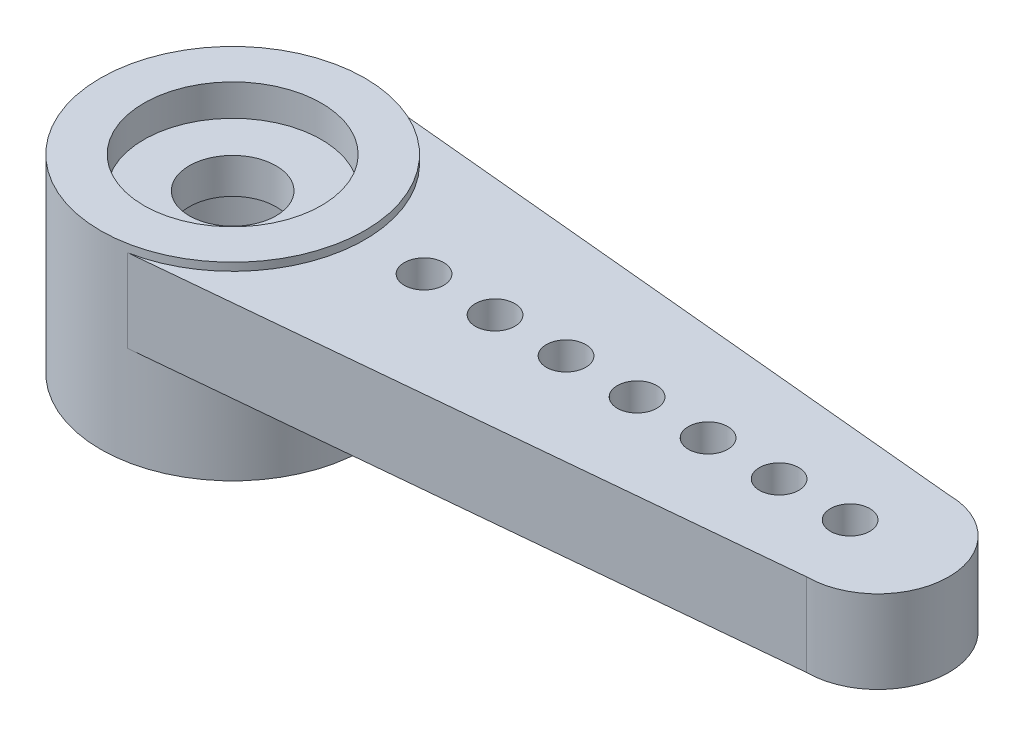
ISO-10303-21;
HEADER;
FILE_DESCRIPTION(('STEP AP214'),'2;1');
FILE_NAME('part.step','',(''),(''),'','','');
FILE_SCHEMA(('AUTOMOTIVE_DESIGN { 1 0 10303 214 1 1 1 1 }'));
ENDSEC;
DATA;
#1=APPLICATION_CONTEXT('core data for automotive mechanical design processes');
#2=APPLICATION_PROTOCOL_DEFINITION('international standard','automotive_design',2000,#1);
#3=PRODUCT_CONTEXT('',#1,'mechanical');
#4=PRODUCT('Part','Part','',(#3));
#5=PRODUCT_RELATED_PRODUCT_CATEGORY('part','',(#4));
#6=PRODUCT_DEFINITION_FORMATION('','',#4);
#7=PRODUCT_DEFINITION_CONTEXT('part definition',#1,'design');
#8=PRODUCT_DEFINITION('design','',#6,#7);
#9=PRODUCT_DEFINITION_SHAPE('','',#8);
#10=(LENGTH_UNIT() NAMED_UNIT(*) SI_UNIT(.MILLI.,.METRE.));
#11=(NAMED_UNIT(*) PLANE_ANGLE_UNIT() SI_UNIT($,.RADIAN.));
#12=(NAMED_UNIT(*) SI_UNIT($,.STERADIAN.) SOLID_ANGLE_UNIT());
#13=UNCERTAINTY_MEASURE_WITH_UNIT(LENGTH_MEASURE(1.E-05),#10,'distance_accuracy_value','');
#14=(GEOMETRIC_REPRESENTATION_CONTEXT(3) GLOBAL_UNCERTAINTY_ASSIGNED_CONTEXT((#13)) GLOBAL_UNIT_ASSIGNED_CONTEXT((#10,
#11,#12)) REPRESENTATION_CONTEXT('',''));
#15=CARTESIAN_POINT('',(0.,0.,0.));
#16=DIRECTION('',(0.,0.,1.));
#17=DIRECTION('',(1.,0.,0.));
#18=AXIS2_PLACEMENT_3D('',#15,#16,#17);
#19=CARTESIAN_POINT('',(-7.4,2.1,0.));
#20=DIRECTION('',(0.,-1.,0.));
#21=DIRECTION('',(0.,0.,-1.));
#22=AXIS2_PLACEMENT_3D('',#19,#20,#21);
#23=CYLINDRICAL_SURFACE('',#22,1.1);
#24=CARTESIAN_POINT('',(-7.4,1.5,0.));
#25=DIRECTION('',(0.,1.,0.));
#26=DIRECTION('',(0.,0.,1.));
#27=AXIS2_PLACEMENT_3D('',#24,#25,#26);
#28=CIRCLE('',#27,1.1);
#29=CARTESIAN_POINT('',(-7.4,1.5,1.1));
#30=VERTEX_POINT('',#29);
#31=EDGE_CURVE('E47',#30,#30,#28,.T.);
#32=ORIENTED_EDGE('',*,*,#31,.T.);
#33=EDGE_LOOP('',(#32));
#34=FACE_BOUND('',#33,.T.);
#35=CARTESIAN_POINT('',(-7.4,0.600000000000001,0.));
#36=DIRECTION('',(0.,-1.,0.));
#37=DIRECTION('',(0.,0.,-1.));
#38=AXIS2_PLACEMENT_3D('',#35,#36,#37);
#39=CIRCLE('',#38,1.1);
#40=CARTESIAN_POINT('',(-7.4,0.600000000000001,-1.1));
#41=VERTEX_POINT('',#40);
#42=EDGE_CURVE('E166',#41,#41,#39,.T.);
#43=ORIENTED_EDGE('',*,*,#42,.T.);
#44=EDGE_LOOP('',(#43));
#45=FACE_BOUND('',#44,.T.);
#46=ADVANCED_FACE('F44',(#34,#45),#23,.F.);
#47=CARTESIAN_POINT('',(-7.4,2.1,0.));
#48=DIRECTION('',(0.,-1.,0.));
#49=DIRECTION('',(0.,0.,-1.));
#50=AXIS2_PLACEMENT_3D('',#47,#48,#49);
#51=CYLINDRICAL_SURFACE('',#50,3.35);
#52=DIRECTION('',(0.,1.,0.));
#53=VECTOR('',#52,1.);
#54=CARTESIAN_POINT('',(-6.77048938733897,-2.5,3.29032162387617));
#55=LINE('',#54,#53);
#56=CARTESIAN_POINT('',(-6.77048938733898,2.1,3.29032162387617));
#57=VERTEX_POINT('',#56);
#58=CARTESIAN_POINT('',(-6.77048938733897,0.,3.29032162387617));
#59=VERTEX_POINT('',#58);
#60=EDGE_CURVE('E106',#57,#59,#55,.F.);
#61=ORIENTED_EDGE('',*,*,#60,.F.);
#62=CARTESIAN_POINT('',(-7.4,2.1,0.));
#63=DIRECTION('',(0.,1.,0.));
#64=DIRECTION('',(0.,0.,1.));
#65=AXIS2_PLACEMENT_3D('',#62,#63,#64);
#66=CIRCLE('',#65,3.35);
#67=CARTESIAN_POINT('',(-6.77048938733892,2.1,-3.29032162387617));
#68=VERTEX_POINT('',#67);
#69=EDGE_CURVE('E11',#57,#68,#66,.T.);
#70=ORIENTED_EDGE('',*,*,#69,.T.);
#71=DIRECTION('',(0.,1.,0.));
#72=VECTOR('',#71,1.);
#73=CARTESIAN_POINT('',(-6.77048938733892,-2.5,-3.29032162387617));
#74=LINE('',#73,#72);
#75=CARTESIAN_POINT('',(-6.77048938733892,0.,-3.29032162387617));
#76=VERTEX_POINT('',#75);
#77=EDGE_CURVE('E81',#68,#76,#74,.F.);
#78=ORIENTED_EDGE('',*,*,#77,.T.);
#79=CARTESIAN_POINT('',(-7.4,0.,0.));
#80=DIRECTION('',(0.,1.,0.));
#81=DIRECTION('',(0.,0.,1.));
#82=AXIS2_PLACEMENT_3D('',#79,#80,#81);
#83=CIRCLE('',#82,3.35);
#84=EDGE_CURVE('E93',#59,#76,#83,.T.);
#85=ORIENTED_EDGE('',*,*,#84,.F.);
#86=EDGE_LOOP('',(#61,#70,#78,#85));
#87=FACE_BOUND('',#86,.T.);
#88=CARTESIAN_POINT('',(-7.4,2.3,0.));
#89=DIRECTION('',(0.,1.,0.));
#90=DIRECTION('',(0.,0.,1.));
#91=AXIS2_PLACEMENT_3D('',#88,#89,#90);
#92=CIRCLE('',#91,3.35);
#93=CARTESIAN_POINT('',(-7.4,2.3,3.35));
#94=VERTEX_POINT('',#93);
#95=EDGE_CURVE('E120',#94,#94,#92,.T.);
#96=ORIENTED_EDGE('',*,*,#95,.F.);
#97=EDGE_LOOP('',(#96));
#98=FACE_BOUND('',#97,.T.);
#99=CARTESIAN_POINT('',(-7.4,-2.5,0.));
#100=DIRECTION('',(0.,1.,0.));
#101=DIRECTION('',(0.,0.,1.));
#102=AXIS2_PLACEMENT_3D('',#99,#100,#101);
#103=CIRCLE('',#102,3.35);
#104=CARTESIAN_POINT('',(-7.4,-2.5,3.35));
#105=VERTEX_POINT('',#104);
#106=EDGE_CURVE('E107',#105,#105,#103,.T.);
#107=ORIENTED_EDGE('',*,*,#106,.T.);
#108=EDGE_LOOP('',(#107));
#109=FACE_BOUND('',#108,.T.);
#110=ADVANCED_FACE('F104',(#87,#98,#109),#51,.T.);
#111=CARTESIAN_POINT('',(0.248841875984799,2.1,2.62488043377514));
#112=DIRECTION('',(-0.0943780711658674,0.,-0.995536428104472));
#113=DIRECTION('',(-0.995536428104472,0.,0.0943780711658674));
#114=AXIS2_PLACEMENT_3D('',#111,#112,#113);
#115=PLANE('',#114);
#116=DIRECTION('',(0.995536428104472,0.,-0.0943780711658674));
#117=VECTOR('',#116,1.);
#118=CARTESIAN_POINT('',(0.248841875984799,2.1,2.62488043377514));
#119=LINE('',#118,#117);
#120=CARTESIAN_POINT('',(8.95,2.1,1.8));
#121=VERTEX_POINT('',#120);
#122=EDGE_CURVE('E123',#57,#121,#119,.T.);
#123=ORIENTED_EDGE('',*,*,#122,.F.);
#124=ORIENTED_EDGE('',*,*,#60,.T.);
#125=DIRECTION('',(0.995536428104472,0.,-0.0943780711658674));
#126=VECTOR('',#125,1.);
#127=CARTESIAN_POINT('',(0.248841875984799,0.,2.62488043377514));
#128=LINE('',#127,#126);
#129=CARTESIAN_POINT('',(8.95,0.,1.8));
#130=VERTEX_POINT('',#129);
#131=EDGE_CURVE('E74',#59,#130,#128,.T.);
#132=ORIENTED_EDGE('',*,*,#131,.T.);
#133=DIRECTION('',(0.,-1.,0.));
#134=VECTOR('',#133,1.);
#135=CARTESIAN_POINT('',(8.95,2.1,1.8));
#136=LINE('',#135,#134);
#137=EDGE_CURVE('E53',#121,#130,#136,.T.);
#138=ORIENTED_EDGE('',*,*,#137,.F.);
#139=EDGE_LOOP('',(#123,#124,#132,#138));
#140=FACE_BOUND('',#139,.T.);
#141=ADVANCED_FACE('F160',(#140),#115,.F.);
#142=CARTESIAN_POINT('',(8.95,2.1,0.));
#143=DIRECTION('',(0.,-1.,0.));
#144=DIRECTION('',(0.,0.,-1.));
#145=AXIS2_PLACEMENT_3D('',#142,#143,#144);
#146=CYLINDRICAL_SURFACE('',#145,1.8);
#147=CARTESIAN_POINT('',(8.95,0.,0.));
#148=DIRECTION('',(0.,1.,0.));
#149=DIRECTION('',(0.,0.,1.));
#150=AXIS2_PLACEMENT_3D('',#147,#148,#149);
#151=CIRCLE('',#150,1.8);
#152=CARTESIAN_POINT('',(8.95,0.,-1.8));
#153=VERTEX_POINT('',#152);
#154=EDGE_CURVE('E127',#130,#153,#151,.T.);
#155=ORIENTED_EDGE('',*,*,#154,.T.);
#156=DIRECTION('',(0.,-1.,0.));
#157=VECTOR('',#156,1.);
#158=CARTESIAN_POINT('',(8.95,2.1,-1.8));
#159=LINE('',#158,#157);
#160=CARTESIAN_POINT('',(8.95,2.1,-1.8));
#161=VERTEX_POINT('',#160);
#162=EDGE_CURVE('E102',#161,#153,#159,.T.);
#163=ORIENTED_EDGE('',*,*,#162,.F.);
#164=CARTESIAN_POINT('',(8.95,2.1,0.));
#165=DIRECTION('',(0.,1.,0.));
#166=DIRECTION('',(0.,0.,1.));
#167=AXIS2_PLACEMENT_3D('',#164,#165,#166);
#168=CIRCLE('',#167,1.8);
#169=EDGE_CURVE('E100',#121,#161,#168,.T.);
#170=ORIENTED_EDGE('',*,*,#169,.F.);
#171=ORIENTED_EDGE('',*,*,#137,.T.);
#172=EDGE_LOOP('',(#155,#163,#170,#171));
#173=FACE_BOUND('',#172,.T.);
#174=ADVANCED_FACE('F133',(#173),#146,.T.);
#175=CARTESIAN_POINT('',(0.248841875984799,2.1,-2.62488043377514));
#176=DIRECTION('',(0.0943780711658672,0.,-0.995536428104472));
#177=DIRECTION('',(-0.995536428104472,0.,-0.0943780711658672));
#178=AXIS2_PLACEMENT_3D('',#175,#176,#177);
#179=PLANE('',#178);
#180=ORIENTED_EDGE('',*,*,#77,.F.);
#181=DIRECTION('',(0.995536428104472,0.,0.0943780711658672));
#182=VECTOR('',#181,1.);
#183=CARTESIAN_POINT('',(0.248841875984799,2.1,-2.62488043377514));
#184=LINE('',#183,#182);
#185=EDGE_CURVE('E62',#68,#161,#184,.T.);
#186=ORIENTED_EDGE('',*,*,#185,.T.);
#187=ORIENTED_EDGE('',*,*,#162,.T.);
#188=DIRECTION('',(0.995536428104472,0.,0.0943780711658672));
#189=VECTOR('',#188,1.);
#190=CARTESIAN_POINT('',(0.248841875984799,0.,-2.62488043377514));
#191=LINE('',#190,#189);
#192=EDGE_CURVE('E91',#76,#153,#191,.T.);
#193=ORIENTED_EDGE('',*,*,#192,.F.);
#194=EDGE_LOOP('',(#180,#186,#187,#193));
#195=FACE_BOUND('',#194,.T.);
#196=ADVANCED_FACE('F90',(#195),#179,.T.);
#197=CARTESIAN_POINT('',(0.,2.1,0.));
#198=DIRECTION('',(0.,1.,0.));
#199=DIRECTION('',(0.,0.,1.));
#200=AXIS2_PLACEMENT_3D('',#197,#198,#199);
#201=PLANE('',#200);
#202=CARTESIAN_POINT('',(-2.55,2.1,0.));
#203=DIRECTION('',(0.,1.,0.));
#204=DIRECTION('',(0.,0.,1.));
#205=AXIS2_PLACEMENT_3D('',#202,#203,#204);
#206=CIRCLE('',#205,0.5);
#207=CARTESIAN_POINT('',(-2.55,2.1,0.5));
#208=VERTEX_POINT('',#207);
#209=EDGE_CURVE('E174',#208,#208,#206,.T.);
#210=ORIENTED_EDGE('',*,*,#209,.F.);
#211=EDGE_LOOP('',(#210));
#212=FACE_BOUND('',#211,.T.);
#213=CARTESIAN_POINT('',(-0.75,2.1,0.));
#214=DIRECTION('',(0.,1.,0.));
#215=DIRECTION('',(0.,0.,1.));
#216=AXIS2_PLACEMENT_3D('',#213,#214,#215);
#217=CIRCLE('',#216,0.5);
#218=CARTESIAN_POINT('',(-0.75,2.1,0.5));
#219=VERTEX_POINT('',#218);
#220=EDGE_CURVE('E343',#219,#219,#217,.T.);
#221=ORIENTED_EDGE('',*,*,#220,.F.);
#222=EDGE_LOOP('',(#221));
#223=FACE_BOUND('',#222,.T.);
#224=CARTESIAN_POINT('',(1.05,2.1,0.));
#225=DIRECTION('',(0.,1.,0.));
#226=DIRECTION('',(0.,0.,1.));
#227=AXIS2_PLACEMENT_3D('',#224,#225,#226);
#228=CIRCLE('',#227,0.5);
#229=CARTESIAN_POINT('',(1.05,2.1,0.5));
#230=VERTEX_POINT('',#229);
#231=EDGE_CURVE('E350',#230,#230,#228,.T.);
#232=ORIENTED_EDGE('',*,*,#231,.F.);
#233=EDGE_LOOP('',(#232));
#234=FACE_BOUND('',#233,.T.);
#235=CARTESIAN_POINT('',(2.85,2.1,0.));
#236=DIRECTION('',(0.,1.,0.));
#237=DIRECTION('',(0.,0.,1.));
#238=AXIS2_PLACEMENT_3D('',#235,#236,#237);
#239=CIRCLE('',#238,0.5);
#240=CARTESIAN_POINT('',(2.85,2.1,0.5));
#241=VERTEX_POINT('',#240);
#242=EDGE_CURVE('E355',#241,#241,#239,.T.);
#243=ORIENTED_EDGE('',*,*,#242,.F.);
#244=EDGE_LOOP('',(#243));
#245=FACE_BOUND('',#244,.T.);
#246=CARTESIAN_POINT('',(4.65,2.1,0.));
#247=DIRECTION('',(0.,1.,0.));
#248=DIRECTION('',(0.,0.,1.));
#249=AXIS2_PLACEMENT_3D('',#246,#247,#248);
#250=CIRCLE('',#249,0.5);
#251=CARTESIAN_POINT('',(4.65,2.1,0.5));
#252=VERTEX_POINT('',#251);
#253=EDGE_CURVE('E361',#252,#252,#250,.T.);
#254=ORIENTED_EDGE('',*,*,#253,.F.);
#255=EDGE_LOOP('',(#254));
#256=FACE_BOUND('',#255,.T.);
#257=CARTESIAN_POINT('',(6.45,2.1,0.));
#258=DIRECTION('',(0.,1.,0.));
#259=DIRECTION('',(0.,0.,1.));
#260=AXIS2_PLACEMENT_3D('',#257,#258,#259);
#261=CIRCLE('',#260,0.499999999999999);
#262=CARTESIAN_POINT('',(6.45,2.1,0.499999999999999));
#263=VERTEX_POINT('',#262);
#264=EDGE_CURVE('E367',#263,#263,#261,.T.);
#265=ORIENTED_EDGE('',*,*,#264,.F.);
#266=EDGE_LOOP('',(#265));
#267=FACE_BOUND('',#266,.T.);
#268=CARTESIAN_POINT('',(8.25,2.1,0.));
#269=DIRECTION('',(0.,1.,0.));
#270=DIRECTION('',(0.,0.,1.));
#271=AXIS2_PLACEMENT_3D('',#268,#269,#270);
#272=CIRCLE('',#271,0.499999999999999);
#273=CARTESIAN_POINT('',(8.25,2.1,0.499999999999999));
#274=VERTEX_POINT('',#273);
#275=EDGE_CURVE('E177',#274,#274,#272,.T.);
#276=ORIENTED_EDGE('',*,*,#275,.F.);
#277=EDGE_LOOP('',(#276));
#278=FACE_BOUND('',#277,.T.);
#279=ORIENTED_EDGE('',*,*,#69,.F.);
#280=ORIENTED_EDGE('',*,*,#122,.T.);
#281=ORIENTED_EDGE('',*,*,#169,.T.);
#282=ORIENTED_EDGE('',*,*,#185,.F.);
#283=EDGE_LOOP('',(#279,#280,#281,#282));
#284=FACE_BOUND('',#283,.T.);
#285=ADVANCED_FACE('F97',(#212,#223,#234,#245,#256,#267,#278,#284),#201,.T.);
#286=CARTESIAN_POINT('',(0.,0.,0.));
#287=DIRECTION('',(0.,1.,0.));
#288=DIRECTION('',(0.,0.,1.));
#289=AXIS2_PLACEMENT_3D('',#286,#287,#288);
#290=PLANE('',#289);
#291=CARTESIAN_POINT('',(-2.55,0.,0.));
#292=DIRECTION('',(0.,1.,0.));
#293=DIRECTION('',(0.,0.,1.));
#294=AXIS2_PLACEMENT_3D('',#291,#292,#293);
#295=CIRCLE('',#294,0.5);
#296=CARTESIAN_POINT('',(-2.55,0.,0.5));
#297=VERTEX_POINT('',#296);
#298=EDGE_CURVE('E169',#297,#297,#295,.F.);
#299=ORIENTED_EDGE('',*,*,#298,.F.);
#300=EDGE_LOOP('',(#299));
#301=FACE_BOUND('',#300,.T.);
#302=CARTESIAN_POINT('',(-0.75,0.,0.));
#303=DIRECTION('',(0.,1.,0.));
#304=DIRECTION('',(0.,0.,1.));
#305=AXIS2_PLACEMENT_3D('',#302,#303,#304);
#306=CIRCLE('',#305,0.5);
#307=CARTESIAN_POINT('',(-0.75,0.,0.5));
#308=VERTEX_POINT('',#307);
#309=EDGE_CURVE('E346',#308,#308,#306,.F.);
#310=ORIENTED_EDGE('',*,*,#309,.F.);
#311=EDGE_LOOP('',(#310));
#312=FACE_BOUND('',#311,.T.);
#313=CARTESIAN_POINT('',(1.05,0.,0.));
#314=DIRECTION('',(0.,1.,0.));
#315=DIRECTION('',(0.,0.,1.));
#316=AXIS2_PLACEMENT_3D('',#313,#314,#315);
#317=CIRCLE('',#316,0.5);
#318=CARTESIAN_POINT('',(1.05,0.,0.5));
#319=VERTEX_POINT('',#318);
#320=EDGE_CURVE('E352',#319,#319,#317,.F.);
#321=ORIENTED_EDGE('',*,*,#320,.F.);
#322=EDGE_LOOP('',(#321));
#323=FACE_BOUND('',#322,.T.);
#324=CARTESIAN_POINT('',(2.85,0.,0.));
#325=DIRECTION('',(0.,1.,0.));
#326=DIRECTION('',(0.,0.,1.));
#327=AXIS2_PLACEMENT_3D('',#324,#325,#326);
#328=CIRCLE('',#327,0.5);
#329=CARTESIAN_POINT('',(2.85,0.,0.5));
#330=VERTEX_POINT('',#329);
#331=EDGE_CURVE('E358',#330,#330,#328,.F.);
#332=ORIENTED_EDGE('',*,*,#331,.F.);
#333=EDGE_LOOP('',(#332));
#334=FACE_BOUND('',#333,.T.);
#335=CARTESIAN_POINT('',(4.65,0.,0.));
#336=DIRECTION('',(0.,1.,0.));
#337=DIRECTION('',(0.,0.,1.));
#338=AXIS2_PLACEMENT_3D('',#335,#336,#337);
#339=CIRCLE('',#338,0.5);
#340=CARTESIAN_POINT('',(4.65,0.,0.5));
#341=VERTEX_POINT('',#340);
#342=EDGE_CURVE('E364',#341,#341,#339,.F.);
#343=ORIENTED_EDGE('',*,*,#342,.F.);
#344=EDGE_LOOP('',(#343));
#345=FACE_BOUND('',#344,.T.);
#346=CARTESIAN_POINT('',(6.45,0.,0.));
#347=DIRECTION('',(0.,1.,0.));
#348=DIRECTION('',(0.,0.,1.));
#349=AXIS2_PLACEMENT_3D('',#346,#347,#348);
#350=CIRCLE('',#349,0.499999999999999);
#351=CARTESIAN_POINT('',(6.45,0.,0.499999999999999));
#352=VERTEX_POINT('',#351);
#353=EDGE_CURVE('E370',#352,#352,#350,.F.);
#354=ORIENTED_EDGE('',*,*,#353,.F.);
#355=EDGE_LOOP('',(#354));
#356=FACE_BOUND('',#355,.T.);
#357=CARTESIAN_POINT('',(8.25,0.,0.));
#358=DIRECTION('',(0.,1.,0.));
#359=DIRECTION('',(0.,0.,1.));
#360=AXIS2_PLACEMENT_3D('',#357,#358,#359);
#361=CIRCLE('',#360,0.499999999999999);
#362=CARTESIAN_POINT('',(8.25,0.,0.499999999999999));
#363=VERTEX_POINT('',#362);
#364=EDGE_CURVE('E374',#363,#363,#361,.F.);
#365=ORIENTED_EDGE('',*,*,#364,.F.);
#366=EDGE_LOOP('',(#365));
#367=FACE_BOUND('',#366,.T.);
#368=ORIENTED_EDGE('',*,*,#131,.F.);
#369=ORIENTED_EDGE('',*,*,#84,.T.);
#370=ORIENTED_EDGE('',*,*,#192,.T.);
#371=ORIENTED_EDGE('',*,*,#154,.F.);
#372=EDGE_LOOP('',(#368,#369,#370,#371));
#373=FACE_BOUND('',#372,.T.);
#374=ADVANCED_FACE('F135',(#301,#312,#323,#334,#345,#356,#367,#373),#290,.F.);
#375=CARTESIAN_POINT('',(-7.4,2.3,0.));
#376=DIRECTION('',(0.,-1.,0.));
#377=DIRECTION('',(0.,0.,-1.));
#378=AXIS2_PLACEMENT_3D('',#375,#376,#377);
#379=CYLINDRICAL_SURFACE('',#378,2.25);
#380=CARTESIAN_POINT('',(-7.4,2.3,0.));
#381=DIRECTION('',(0.,1.,0.));
#382=DIRECTION('',(0.,0.,1.));
#383=AXIS2_PLACEMENT_3D('',#380,#381,#382);
#384=CIRCLE('',#383,2.25);
#385=CARTESIAN_POINT('',(-7.4,2.3,2.25));
#386=VERTEX_POINT('',#385);
#387=EDGE_CURVE('E117',#386,#386,#384,.T.);
#388=ORIENTED_EDGE('',*,*,#387,.T.);
#389=EDGE_LOOP('',(#388));
#390=FACE_BOUND('',#389,.T.);
#391=CARTESIAN_POINT('',(-7.4,1.5,0.));
#392=DIRECTION('',(0.,1.,0.));
#393=DIRECTION('',(0.,0.,1.));
#394=AXIS2_PLACEMENT_3D('',#391,#392,#393);
#395=CIRCLE('',#394,2.25);
#396=CARTESIAN_POINT('',(-7.4,1.5,2.25));
#397=VERTEX_POINT('',#396);
#398=EDGE_CURVE('E92',#397,#397,#395,.T.);
#399=ORIENTED_EDGE('',*,*,#398,.F.);
#400=EDGE_LOOP('',(#399));
#401=FACE_BOUND('',#400,.T.);
#402=ADVANCED_FACE('F137',(#390,#401),#379,.F.);
#403=CARTESIAN_POINT('',(0.,2.3,0.));
#404=DIRECTION('',(0.,1.,0.));
#405=DIRECTION('',(0.,0.,1.));
#406=AXIS2_PLACEMENT_3D('',#403,#404,#405);
#407=PLANE('',#406);
#408=ORIENTED_EDGE('',*,*,#387,.F.);
#409=EDGE_LOOP('',(#408));
#410=FACE_BOUND('',#409,.T.);
#411=ORIENTED_EDGE('',*,*,#95,.T.);
#412=EDGE_LOOP('',(#411));
#413=FACE_BOUND('',#412,.T.);
#414=ADVANCED_FACE('F145',(#410,#413),#407,.T.);
#415=CARTESIAN_POINT('',(-7.4,1.5,0.));
#416=DIRECTION('',(0.,1.,0.));
#417=DIRECTION('',(0.,0.,1.));
#418=AXIS2_PLACEMENT_3D('',#415,#416,#417);
#419=PLANE('',#418);
#420=ORIENTED_EDGE('',*,*,#31,.F.);
#421=EDGE_LOOP('',(#420));
#422=FACE_BOUND('',#421,.T.);
#423=ORIENTED_EDGE('',*,*,#398,.T.);
#424=EDGE_LOOP('',(#423));
#425=FACE_BOUND('',#424,.T.);
#426=ADVANCED_FACE('F187',(#422,#425),#419,.T.);
#427=CARTESIAN_POINT('',(-7.4,-2.5,0.));
#428=DIRECTION('',(0.,1.,0.));
#429=DIRECTION('',(0.,0.,1.));
#430=AXIS2_PLACEMENT_3D('',#427,#428,#429);
#431=CYLINDRICAL_SURFACE('',#430,2.25);
#432=CARTESIAN_POINT('',(-7.4,-2.5,0.));
#433=DIRECTION('',(0.,1.,0.));
#434=DIRECTION('',(0.,0.,1.));
#435=AXIS2_PLACEMENT_3D('',#432,#433,#434);
#436=CIRCLE('',#435,2.25);
#437=CARTESIAN_POINT('',(-7.4,-2.5,2.25));
#438=VERTEX_POINT('',#437);
#439=EDGE_CURVE('E111',#438,#438,#436,.T.);
#440=ORIENTED_EDGE('',*,*,#439,.F.);
#441=EDGE_LOOP('',(#440));
#442=FACE_BOUND('',#441,.T.);
#443=CARTESIAN_POINT('',(-7.4,0.600000000000001,0.));
#444=DIRECTION('',(0.,-1.,0.));
#445=DIRECTION('',(0.,0.,-1.));
#446=AXIS2_PLACEMENT_3D('',#443,#444,#445);
#447=CIRCLE('',#446,2.25);
#448=CARTESIAN_POINT('',(-7.4,0.600000000000001,-2.25));
#449=VERTEX_POINT('',#448);
#450=EDGE_CURVE('E168',#449,#449,#447,.T.);
#451=ORIENTED_EDGE('',*,*,#450,.F.);
#452=EDGE_LOOP('',(#451));
#453=FACE_BOUND('',#452,.T.);
#454=ADVANCED_FACE('F185',(#442,#453),#431,.F.);
#455=CARTESIAN_POINT('',(-7.4,-2.5,0.));
#456=DIRECTION('',(0.,1.,0.));
#457=DIRECTION('',(0.,0.,1.));
#458=AXIS2_PLACEMENT_3D('',#455,#456,#457);
#459=PLANE('',#458);
#460=ORIENTED_EDGE('',*,*,#439,.T.);
#461=EDGE_LOOP('',(#460));
#462=FACE_BOUND('',#461,.T.);
#463=ORIENTED_EDGE('',*,*,#106,.F.);
#464=EDGE_LOOP('',(#463));
#465=FACE_BOUND('',#464,.T.);
#466=ADVANCED_FACE('F182',(#462,#465),#459,.F.);
#467=CARTESIAN_POINT('',(-7.4,0.600000000000001,0.));
#468=DIRECTION('',(0.,-1.,0.));
#469=DIRECTION('',(0.,0.,-1.));
#470=AXIS2_PLACEMENT_3D('',#467,#468,#469);
#471=PLANE('',#470);
#472=ORIENTED_EDGE('',*,*,#42,.F.);
#473=EDGE_LOOP('',(#472));
#474=FACE_BOUND('',#473,.T.);
#475=ORIENTED_EDGE('',*,*,#450,.T.);
#476=EDGE_LOOP('',(#475));
#477=FACE_BOUND('',#476,.T.);
#478=ADVANCED_FACE('F191',(#474,#477),#471,.T.);
#479=CARTESIAN_POINT('',(8.25,-2.501,0.));
#480=DIRECTION('',(0.,1.,0.));
#481=DIRECTION('',(0.,0.,1.));
#482=AXIS2_PLACEMENT_3D('',#479,#480,#481);
#483=CYLINDRICAL_SURFACE('',#482,0.499999999999999);
#484=ORIENTED_EDGE('',*,*,#275,.T.);
#485=EDGE_LOOP('',(#484));
#486=FACE_BOUND('',#485,.T.);
#487=ORIENTED_EDGE('',*,*,#364,.T.);
#488=EDGE_LOOP('',(#487));
#489=FACE_BOUND('',#488,.T.);
#490=ADVANCED_FACE('F193',(#486,#489),#483,.F.);
#491=CARTESIAN_POINT('',(6.45,-2.501,0.));
#492=DIRECTION('',(0.,1.,0.));
#493=DIRECTION('',(0.,0.,1.));
#494=AXIS2_PLACEMENT_3D('',#491,#492,#493);
#495=CYLINDRICAL_SURFACE('',#494,0.499999999999999);
#496=ORIENTED_EDGE('',*,*,#264,.T.);
#497=EDGE_LOOP('',(#496));
#498=FACE_BOUND('',#497,.T.);
#499=ORIENTED_EDGE('',*,*,#353,.T.);
#500=EDGE_LOOP('',(#499));
#501=FACE_BOUND('',#500,.T.);
#502=ADVANCED_FACE('F197',(#498,#501),#495,.F.);
#503=CARTESIAN_POINT('',(4.65,-2.501,0.));
#504=DIRECTION('',(0.,1.,0.));
#505=DIRECTION('',(0.,0.,1.));
#506=AXIS2_PLACEMENT_3D('',#503,#504,#505);
#507=CYLINDRICAL_SURFACE('',#506,0.5);
#508=ORIENTED_EDGE('',*,*,#253,.T.);
#509=EDGE_LOOP('',(#508));
#510=FACE_BOUND('',#509,.T.);
#511=ORIENTED_EDGE('',*,*,#342,.T.);
#512=EDGE_LOOP('',(#511));
#513=FACE_BOUND('',#512,.T.);
#514=ADVANCED_FACE('F288',(#510,#513),#507,.F.);
#515=CARTESIAN_POINT('',(2.85,-2.501,0.));
#516=DIRECTION('',(0.,1.,0.));
#517=DIRECTION('',(0.,0.,1.));
#518=AXIS2_PLACEMENT_3D('',#515,#516,#517);
#519=CYLINDRICAL_SURFACE('',#518,0.5);
#520=ORIENTED_EDGE('',*,*,#242,.T.);
#521=EDGE_LOOP('',(#520));
#522=FACE_BOUND('',#521,.T.);
#523=ORIENTED_EDGE('',*,*,#331,.T.);
#524=EDGE_LOOP('',(#523));
#525=FACE_BOUND('',#524,.T.);
#526=ADVANCED_FACE('F297',(#522,#525),#519,.F.);
#527=CARTESIAN_POINT('',(1.05,-2.501,0.));
#528=DIRECTION('',(0.,1.,0.));
#529=DIRECTION('',(0.,0.,1.));
#530=AXIS2_PLACEMENT_3D('',#527,#528,#529);
#531=CYLINDRICAL_SURFACE('',#530,0.5);
#532=ORIENTED_EDGE('',*,*,#231,.T.);
#533=EDGE_LOOP('',(#532));
#534=FACE_BOUND('',#533,.T.);
#535=ORIENTED_EDGE('',*,*,#320,.T.);
#536=EDGE_LOOP('',(#535));
#537=FACE_BOUND('',#536,.T.);
#538=ADVANCED_FACE('F307',(#534,#537),#531,.F.);
#539=CARTESIAN_POINT('',(-0.75,-2.501,0.));
#540=DIRECTION('',(0.,1.,0.));
#541=DIRECTION('',(0.,0.,1.));
#542=AXIS2_PLACEMENT_3D('',#539,#540,#541);
#543=CYLINDRICAL_SURFACE('',#542,0.5);
#544=ORIENTED_EDGE('',*,*,#220,.T.);
#545=EDGE_LOOP('',(#544));
#546=FACE_BOUND('',#545,.T.);
#547=ORIENTED_EDGE('',*,*,#309,.T.);
#548=EDGE_LOOP('',(#547));
#549=FACE_BOUND('',#548,.T.);
#550=ADVANCED_FACE('F317',(#546,#549),#543,.F.);
#551=CARTESIAN_POINT('',(-2.55,-2.501,0.));
#552=DIRECTION('',(0.,1.,0.));
#553=DIRECTION('',(0.,0.,1.));
#554=AXIS2_PLACEMENT_3D('',#551,#552,#553);
#555=CYLINDRICAL_SURFACE('',#554,0.5);
#556=ORIENTED_EDGE('',*,*,#209,.T.);
#557=EDGE_LOOP('',(#556));
#558=FACE_BOUND('',#557,.T.);
#559=ORIENTED_EDGE('',*,*,#298,.T.);
#560=EDGE_LOOP('',(#559));
#561=FACE_BOUND('',#560,.T.);
#562=ADVANCED_FACE('F327',(#558,#561),#555,.F.);
#563=CLOSED_SHELL('',(#46,#110,#141,#174,#196,#285,#374,#402,#414,#426,#454,#466,#478,#490,#502,
#514,#526,#538,#550,#562));
#564=MANIFOLD_SOLID_BREP('B2',#563);
#565=ADVANCED_BREP_SHAPE_REPRESENTATION('',(#18,#564),#14);
#566=SHAPE_DEFINITION_REPRESENTATION(#9,#565);
ENDSEC;
END-ISO-10303-21;
